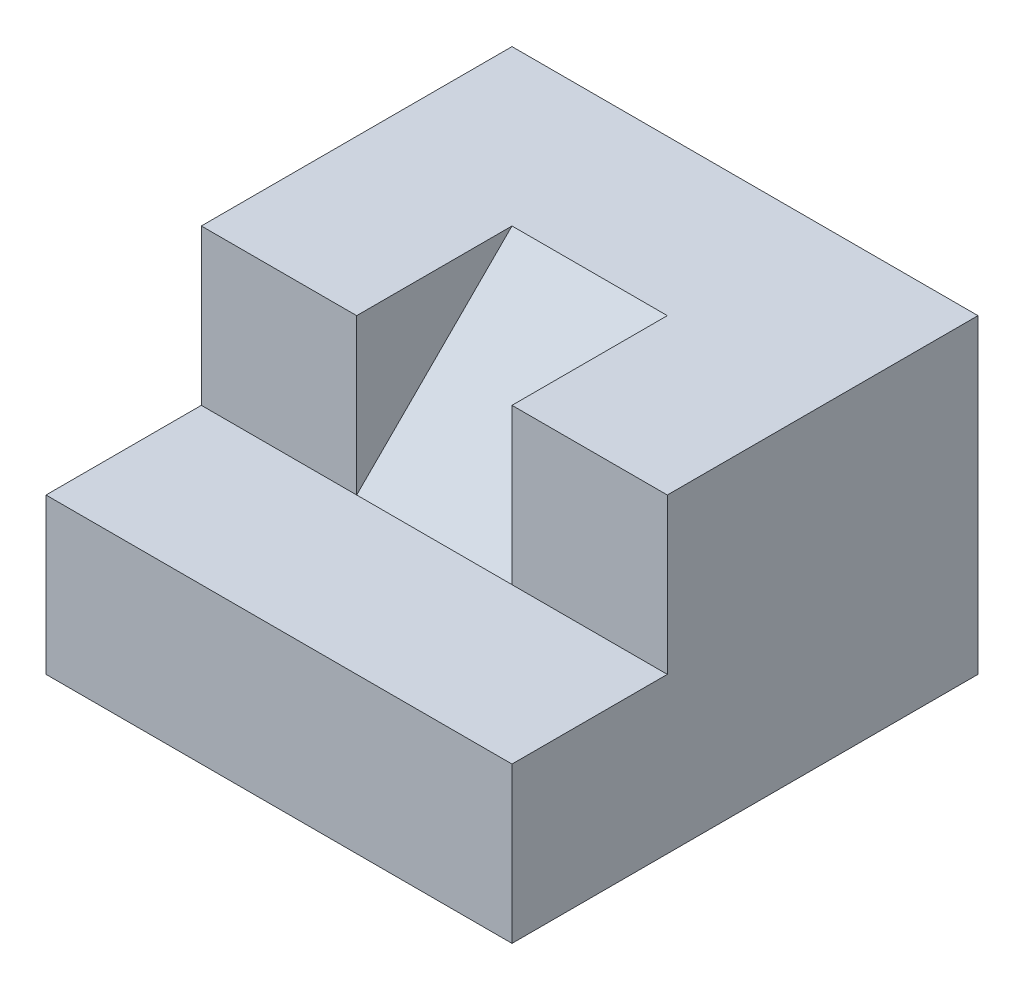
ISO-10303-21;
HEADER;
FILE_DESCRIPTION(('STEP AP214'),'2;1');
FILE_NAME('part.step','',(''),(''),'','','');
FILE_SCHEMA(('AUTOMOTIVE_DESIGN { 1 0 10303 214 1 1 1 1 }'));
ENDSEC;
DATA;
#1=APPLICATION_CONTEXT('core data for automotive mechanical design processes');
#2=APPLICATION_PROTOCOL_DEFINITION('international standard','automotive_design',2000,#1);
#3=PRODUCT_CONTEXT('',#1,'mechanical');
#4=PRODUCT('Part','Part','',(#3));
#5=PRODUCT_RELATED_PRODUCT_CATEGORY('part','',(#4));
#6=PRODUCT_DEFINITION_FORMATION('','',#4);
#7=PRODUCT_DEFINITION_CONTEXT('part definition',#1,'design');
#8=PRODUCT_DEFINITION('design','',#6,#7);
#9=PRODUCT_DEFINITION_SHAPE('','',#8);
#10=(LENGTH_UNIT() NAMED_UNIT(*) SI_UNIT(.MILLI.,.METRE.));
#11=(NAMED_UNIT(*) PLANE_ANGLE_UNIT() SI_UNIT($,.RADIAN.));
#12=(NAMED_UNIT(*) SI_UNIT($,.STERADIAN.) SOLID_ANGLE_UNIT());
#13=UNCERTAINTY_MEASURE_WITH_UNIT(LENGTH_MEASURE(1.E-05),#10,'distance_accuracy_value','');
#14=(GEOMETRIC_REPRESENTATION_CONTEXT(3) GLOBAL_UNCERTAINTY_ASSIGNED_CONTEXT((#13)) GLOBAL_UNIT_ASSIGNED_CONTEXT((#10,
#11,#12)) REPRESENTATION_CONTEXT('',''));
#15=CARTESIAN_POINT('',(0.,0.,0.));
#16=DIRECTION('',(0.,0.,1.));
#17=DIRECTION('',(1.,0.,0.));
#18=AXIS2_PLACEMENT_3D('',#15,#16,#17);
#19=CARTESIAN_POINT('',(147.260393995586,20.,10.));
#20=DIRECTION('',(0.,0.707106781186547,0.707106781186548));
#21=DIRECTION('',(0.,-0.707106781186548,0.707106781186547));
#22=AXIS2_PLACEMENT_3D('',#19,#20,#21);
#23=PLANE('',#22);
#24=DIRECTION('',(1.,0.,0.));
#25=VECTOR('',#24,1.);
#26=CARTESIAN_POINT('',(-30.,20.,10.));
#27=LINE('',#26,#25);
#28=CARTESIAN_POINT('',(-10.,20.,10.));
#29=VERTEX_POINT('',#28);
#30=CARTESIAN_POINT('',(10.,20.,10.));
#31=VERTEX_POINT('',#30);
#32=EDGE_CURVE('E154',#29,#31,#27,.T.);
#33=ORIENTED_EDGE('',*,*,#32,.T.);
#34=DIRECTION('',(0.,0.707106781186548,-0.707106781186547));
#35=VECTOR('',#34,1.);
#36=CARTESIAN_POINT('',(10.,20.,10.));
#37=LINE('',#36,#35);
#38=CARTESIAN_POINT('',(10.,40.,-10.));
#39=VERTEX_POINT('',#38);
#40=EDGE_CURVE('E52',#31,#39,#37,.T.);
#41=ORIENTED_EDGE('',*,*,#40,.T.);
#42=DIRECTION('',(-1.,0.,0.));
#43=VECTOR('',#42,1.);
#44=CARTESIAN_POINT('',(147.260393995586,40.,-10.));
#45=LINE('',#44,#43);
#46=CARTESIAN_POINT('',(-10.,40.,-10.));
#47=VERTEX_POINT('',#46);
#48=EDGE_CURVE('E147',#39,#47,#45,.T.);
#49=ORIENTED_EDGE('',*,*,#48,.T.);
#50=DIRECTION('',(0.,-0.707106781186548,0.707106781186547));
#51=VECTOR('',#50,1.);
#52=CARTESIAN_POINT('',(-10.,20.,10.));
#53=LINE('',#52,#51);
#54=EDGE_CURVE('E11',#47,#29,#53,.T.);
#55=ORIENTED_EDGE('',*,*,#54,.T.);
#56=EDGE_LOOP('',(#33,#41,#49,#55));
#57=FACE_BOUND('',#56,.T.);
#58=ADVANCED_FACE('F37',(#57),#23,.T.);
#59=CARTESIAN_POINT('',(0.,40.,0.));
#60=DIRECTION('',(0.,-1.,0.));
#61=DIRECTION('',(0.,0.,-1.));
#62=AXIS2_PLACEMENT_3D('',#59,#60,#61);
#63=PLANE('',#62);
#64=ORIENTED_EDGE('',*,*,#48,.F.);
#65=DIRECTION('',(0.,0.,1.));
#66=VECTOR('',#65,1.);
#67=CARTESIAN_POINT('',(10.,40.,-9.99999999999999));
#68=LINE('',#67,#66);
#69=CARTESIAN_POINT('',(10.,40.,10.));
#70=VERTEX_POINT('',#69);
#71=EDGE_CURVE('E124',#39,#70,#68,.T.);
#72=ORIENTED_EDGE('',*,*,#71,.T.);
#73=DIRECTION('',(1.,0.,0.));
#74=VECTOR('',#73,1.);
#75=CARTESIAN_POINT('',(10.,40.,10.));
#76=LINE('',#75,#74);
#77=CARTESIAN_POINT('',(30.,40.,10.));
#78=VERTEX_POINT('',#77);
#79=EDGE_CURVE('E121',#70,#78,#76,.T.);
#80=ORIENTED_EDGE('',*,*,#79,.T.);
#81=DIRECTION('',(0.,0.,-1.));
#82=VECTOR('',#81,1.);
#83=CARTESIAN_POINT('',(30.,40.,30.));
#84=LINE('',#83,#82);
#85=CARTESIAN_POINT('',(30.,40.,-30.));
#86=VERTEX_POINT('',#85);
#87=EDGE_CURVE('E108',#78,#86,#84,.T.);
#88=ORIENTED_EDGE('',*,*,#87,.T.);
#89=DIRECTION('',(-1.,0.,0.));
#90=VECTOR('',#89,1.);
#91=CARTESIAN_POINT('',(-30.,40.,-30.));
#92=LINE('',#91,#90);
#93=CARTESIAN_POINT('',(-30.,40.,-30.));
#94=VERTEX_POINT('',#93);
#95=EDGE_CURVE('E117',#86,#94,#92,.T.);
#96=ORIENTED_EDGE('',*,*,#95,.T.);
#97=DIRECTION('',(0.,0.,1.));
#98=VECTOR('',#97,1.);
#99=CARTESIAN_POINT('',(-30.,40.,30.));
#100=LINE('',#99,#98);
#101=CARTESIAN_POINT('',(-30.,40.,10.));
#102=VERTEX_POINT('',#101);
#103=EDGE_CURVE('E161',#94,#102,#100,.T.);
#104=ORIENTED_EDGE('',*,*,#103,.T.);
#105=DIRECTION('',(1.,0.,0.));
#106=VECTOR('',#105,1.);
#107=CARTESIAN_POINT('',(-30.,40.,10.));
#108=LINE('',#107,#106);
#109=CARTESIAN_POINT('',(-10.,40.,10.));
#110=VERTEX_POINT('',#109);
#111=EDGE_CURVE('E132',#102,#110,#108,.T.);
#112=ORIENTED_EDGE('',*,*,#111,.T.);
#113=DIRECTION('',(0.,0.,-1.));
#114=VECTOR('',#113,1.);
#115=CARTESIAN_POINT('',(-10.,40.,10.));
#116=LINE('',#115,#114);
#117=EDGE_CURVE('E138',#110,#47,#116,.T.);
#118=ORIENTED_EDGE('',*,*,#117,.T.);
#119=EDGE_LOOP('',(#64,#72,#80,#88,#96,#104,#112,#118));
#120=FACE_BOUND('',#119,.T.);
#121=ADVANCED_FACE('F122',(#120),#63,.F.);
#122=CARTESIAN_POINT('',(30.,40.,30.));
#123=DIRECTION('',(-1.,0.,0.));
#124=DIRECTION('',(0.,0.,1.));
#125=AXIS2_PLACEMENT_3D('',#122,#123,#124);
#126=PLANE('',#125);
#127=ORIENTED_EDGE('',*,*,#87,.F.);
#128=DIRECTION('',(0.,-1.,0.));
#129=VECTOR('',#128,1.);
#130=CARTESIAN_POINT('',(30.,40.,10.));
#131=LINE('',#130,#129);
#132=CARTESIAN_POINT('',(30.,20.,10.));
#133=VERTEX_POINT('',#132);
#134=EDGE_CURVE('E112',#78,#133,#131,.T.);
#135=ORIENTED_EDGE('',*,*,#134,.T.);
#136=DIRECTION('',(0.,0.,1.));
#137=VECTOR('',#136,1.);
#138=CARTESIAN_POINT('',(30.,20.,10.));
#139=LINE('',#138,#137);
#140=CARTESIAN_POINT('',(30.,20.,30.));
#141=VERTEX_POINT('',#140);
#142=EDGE_CURVE('E156',#133,#141,#139,.T.);
#143=ORIENTED_EDGE('',*,*,#142,.T.);
#144=DIRECTION('',(0.,-1.,0.));
#145=VECTOR('',#144,1.);
#146=CARTESIAN_POINT('',(30.,40.,30.));
#147=LINE('',#146,#145);
#148=CARTESIAN_POINT('',(30.,0.,30.));
#149=VERTEX_POINT('',#148);
#150=EDGE_CURVE('E163',#141,#149,#147,.T.);
#151=ORIENTED_EDGE('',*,*,#150,.T.);
#152=DIRECTION('',(0.,0.,-1.));
#153=VECTOR('',#152,1.);
#154=CARTESIAN_POINT('',(30.,0.,30.));
#155=LINE('',#154,#153);
#156=CARTESIAN_POINT('',(30.,0.,-30.));
#157=VERTEX_POINT('',#156);
#158=EDGE_CURVE('E158',#149,#157,#155,.T.);
#159=ORIENTED_EDGE('',*,*,#158,.T.);
#160=DIRECTION('',(0.,-1.,0.));
#161=VECTOR('',#160,1.);
#162=CARTESIAN_POINT('',(30.,40.,-30.));
#163=LINE('',#162,#161);
#164=EDGE_CURVE('E45',#86,#157,#163,.T.);
#165=ORIENTED_EDGE('',*,*,#164,.F.);
#166=EDGE_LOOP('',(#127,#135,#143,#151,#159,#165));
#167=FACE_BOUND('',#166,.T.);
#168=ADVANCED_FACE('F39',(#167),#126,.F.);
#169=CARTESIAN_POINT('',(-30.,40.,30.));
#170=DIRECTION('',(1.,0.,0.));
#171=DIRECTION('',(0.,0.,-1.));
#172=AXIS2_PLACEMENT_3D('',#169,#170,#171);
#173=PLANE('',#172);
#174=DIRECTION('',(0.,-1.,0.));
#175=VECTOR('',#174,1.);
#176=CARTESIAN_POINT('',(-30.,40.,10.));
#177=LINE('',#176,#175);
#178=CARTESIAN_POINT('',(-30.,20.,10.));
#179=VERTEX_POINT('',#178);
#180=EDGE_CURVE('E144',#102,#179,#177,.T.);
#181=ORIENTED_EDGE('',*,*,#180,.F.);
#182=ORIENTED_EDGE('',*,*,#103,.F.);
#183=DIRECTION('',(0.,-1.,0.));
#184=VECTOR('',#183,1.);
#185=CARTESIAN_POINT('',(-30.,40.,-30.));
#186=LINE('',#185,#184);
#187=CARTESIAN_POINT('',(-30.,0.,-30.));
#188=VERTEX_POINT('',#187);
#189=EDGE_CURVE('E175',#94,#188,#186,.T.);
#190=ORIENTED_EDGE('',*,*,#189,.T.);
#191=DIRECTION('',(0.,0.,1.));
#192=VECTOR('',#191,1.);
#193=CARTESIAN_POINT('',(-30.,0.,30.));
#194=LINE('',#193,#192);
#195=CARTESIAN_POINT('',(-30.,0.,30.));
#196=VERTEX_POINT('',#195);
#197=EDGE_CURVE('E167',#188,#196,#194,.T.);
#198=ORIENTED_EDGE('',*,*,#197,.T.);
#199=DIRECTION('',(0.,-1.,0.));
#200=VECTOR('',#199,1.);
#201=CARTESIAN_POINT('',(-30.,40.,30.));
#202=LINE('',#201,#200);
#203=CARTESIAN_POINT('',(-30.,20.,30.));
#204=VERTEX_POINT('',#203);
#205=EDGE_CURVE('E173',#204,#196,#202,.T.);
#206=ORIENTED_EDGE('',*,*,#205,.F.);
#207=DIRECTION('',(0.,0.,1.));
#208=VECTOR('',#207,1.);
#209=CARTESIAN_POINT('',(-30.,20.,10.));
#210=LINE('',#209,#208);
#211=EDGE_CURVE('E153',#179,#204,#210,.T.);
#212=ORIENTED_EDGE('',*,*,#211,.F.);
#213=EDGE_LOOP('',(#181,#182,#190,#198,#206,#212));
#214=FACE_BOUND('',#213,.T.);
#215=ADVANCED_FACE('F189',(#214),#173,.F.);
#216=CARTESIAN_POINT('',(-30.,40.,-30.));
#217=DIRECTION('',(0.,0.,1.));
#218=DIRECTION('',(1.,0.,0.));
#219=AXIS2_PLACEMENT_3D('',#216,#217,#218);
#220=PLANE('',#219);
#221=DIRECTION('',(-1.,0.,0.));
#222=VECTOR('',#221,1.);
#223=CARTESIAN_POINT('',(-30.,0.,-30.));
#224=LINE('',#223,#222);
#225=EDGE_CURVE('E165',#157,#188,#224,.T.);
#226=ORIENTED_EDGE('',*,*,#225,.T.);
#227=ORIENTED_EDGE('',*,*,#189,.F.);
#228=ORIENTED_EDGE('',*,*,#95,.F.);
#229=ORIENTED_EDGE('',*,*,#164,.T.);
#230=EDGE_LOOP('',(#226,#227,#228,#229));
#231=FACE_BOUND('',#230,.T.);
#232=ADVANCED_FACE('F178',(#231),#220,.F.);
#233=CARTESIAN_POINT('',(-30.,40.,30.));
#234=DIRECTION('',(0.,0.,-1.));
#235=DIRECTION('',(-1.,0.,0.));
#236=AXIS2_PLACEMENT_3D('',#233,#234,#235);
#237=PLANE('',#236);
#238=ORIENTED_EDGE('',*,*,#150,.F.);
#239=DIRECTION('',(1.,0.,0.));
#240=VECTOR('',#239,1.);
#241=CARTESIAN_POINT('',(-30.,20.,30.));
#242=LINE('',#241,#240);
#243=EDGE_CURVE('E149',#204,#141,#242,.T.);
#244=ORIENTED_EDGE('',*,*,#243,.F.);
#245=ORIENTED_EDGE('',*,*,#205,.T.);
#246=DIRECTION('',(1.,0.,0.));
#247=VECTOR('',#246,1.);
#248=CARTESIAN_POINT('',(-30.,0.,30.));
#249=LINE('',#248,#247);
#250=EDGE_CURVE('E118',#196,#149,#249,.T.);
#251=ORIENTED_EDGE('',*,*,#250,.T.);
#252=EDGE_LOOP('',(#238,#244,#245,#251));
#253=FACE_BOUND('',#252,.T.);
#254=ADVANCED_FACE('F223',(#253),#237,.F.);
#255=CARTESIAN_POINT('',(0.,0.,0.));
#256=DIRECTION('',(0.,-1.,0.));
#257=DIRECTION('',(0.,0.,-1.));
#258=AXIS2_PLACEMENT_3D('',#255,#256,#257);
#259=PLANE('',#258);
#260=ORIENTED_EDGE('',*,*,#158,.F.);
#261=ORIENTED_EDGE('',*,*,#250,.F.);
#262=ORIENTED_EDGE('',*,*,#197,.F.);
#263=ORIENTED_EDGE('',*,*,#225,.F.);
#264=EDGE_LOOP('',(#260,#261,#262,#263));
#265=FACE_BOUND('',#264,.T.);
#266=ADVANCED_FACE('F184',(#265),#259,.T.);
#267=CARTESIAN_POINT('',(-30.,20.,10.));
#268=DIRECTION('',(0.,-1.,0.));
#269=DIRECTION('',(0.,0.,-1.));
#270=AXIS2_PLACEMENT_3D('',#267,#268,#269);
#271=PLANE('',#270);
#272=ORIENTED_EDGE('',*,*,#243,.T.);
#273=ORIENTED_EDGE('',*,*,#142,.F.);
#274=DIRECTION('',(1.,0.,0.));
#275=VECTOR('',#274,1.);
#276=CARTESIAN_POINT('',(10.,20.,10.));
#277=LINE('',#276,#275);
#278=EDGE_CURVE('E60',#31,#133,#277,.T.);
#279=ORIENTED_EDGE('',*,*,#278,.F.);
#280=ORIENTED_EDGE('',*,*,#32,.F.);
#281=EDGE_CURVE('E150',#179,#29,#27,.T.);
#282=ORIENTED_EDGE('',*,*,#281,.F.);
#283=ORIENTED_EDGE('',*,*,#211,.T.);
#284=EDGE_LOOP('',(#272,#273,#279,#280,#282,#283));
#285=FACE_BOUND('',#284,.T.);
#286=ADVANCED_FACE('F218',(#285),#271,.F.);
#287=CARTESIAN_POINT('',(-30.,40.,10.));
#288=DIRECTION('',(0.,0.,-1.));
#289=DIRECTION('',(-1.,0.,0.));
#290=AXIS2_PLACEMENT_3D('',#287,#288,#289);
#291=PLANE('',#290);
#292=ORIENTED_EDGE('',*,*,#281,.T.);
#293=DIRECTION('',(0.,-1.,0.));
#294=VECTOR('',#293,1.);
#295=CARTESIAN_POINT('',(-10.,40.,10.));
#296=LINE('',#295,#294);
#297=EDGE_CURVE('E141',#110,#29,#296,.T.);
#298=ORIENTED_EDGE('',*,*,#297,.F.);
#299=ORIENTED_EDGE('',*,*,#111,.F.);
#300=ORIENTED_EDGE('',*,*,#180,.T.);
#301=EDGE_LOOP('',(#292,#298,#299,#300));
#302=FACE_BOUND('',#301,.T.);
#303=ADVANCED_FACE('F195',(#302),#291,.F.);
#304=CARTESIAN_POINT('',(-10.,40.,10.));
#305=DIRECTION('',(-1.,0.,0.));
#306=DIRECTION('',(0.,0.,1.));
#307=AXIS2_PLACEMENT_3D('',#304,#305,#306);
#308=PLANE('',#307);
#309=ORIENTED_EDGE('',*,*,#54,.F.);
#310=ORIENTED_EDGE('',*,*,#117,.F.);
#311=ORIENTED_EDGE('',*,*,#297,.T.);
#312=EDGE_LOOP('',(#309,#310,#311));
#313=FACE_BOUND('',#312,.T.);
#314=ADVANCED_FACE('F199',(#313),#308,.F.);
#315=CARTESIAN_POINT('',(10.,40.,10.));
#316=DIRECTION('',(0.,0.,-1.));
#317=DIRECTION('',(-1.,0.,0.));
#318=AXIS2_PLACEMENT_3D('',#315,#316,#317);
#319=PLANE('',#318);
#320=ORIENTED_EDGE('',*,*,#278,.T.);
#321=ORIENTED_EDGE('',*,*,#134,.F.);
#322=ORIENTED_EDGE('',*,*,#79,.F.);
#323=DIRECTION('',(0.,-1.,0.));
#324=VECTOR('',#323,1.);
#325=CARTESIAN_POINT('',(10.,40.,10.));
#326=LINE('',#325,#324);
#327=EDGE_CURVE('E130',#70,#31,#326,.T.);
#328=ORIENTED_EDGE('',*,*,#327,.T.);
#329=EDGE_LOOP('',(#320,#321,#322,#328));
#330=FACE_BOUND('',#329,.T.);
#331=ADVANCED_FACE('F129',(#330),#319,.F.);
#332=CARTESIAN_POINT('',(10.,40.,-9.99999999999999));
#333=DIRECTION('',(1.,0.,0.));
#334=DIRECTION('',(0.,0.,-1.));
#335=AXIS2_PLACEMENT_3D('',#332,#333,#334);
#336=PLANE('',#335);
#337=ORIENTED_EDGE('',*,*,#40,.F.);
#338=ORIENTED_EDGE('',*,*,#327,.F.);
#339=ORIENTED_EDGE('',*,*,#71,.F.);
#340=EDGE_LOOP('',(#337,#338,#339));
#341=FACE_BOUND('',#340,.T.);
#342=ADVANCED_FACE('F201',(#341),#336,.F.);
#343=CLOSED_SHELL('',(#58,#121,#168,#215,#232,#254,#266,#286,#303,#314,#331,#342));
#344=MANIFOLD_SOLID_BREP('B2',#343);
#345=ADVANCED_BREP_SHAPE_REPRESENTATION('',(#18,#344),#14);
#346=SHAPE_DEFINITION_REPRESENTATION(#9,#345);
ENDSEC;
END-ISO-10303-21;
